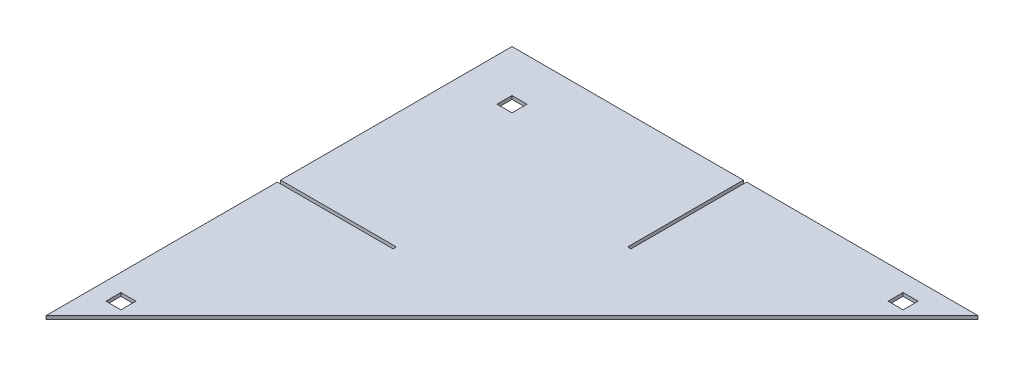
ISO-10303-21;
HEADER;
FILE_DESCRIPTION(('STEP AP214'),'2;1');
FILE_NAME('part.step','',(''),(''),'','','');
FILE_SCHEMA(('AUTOMOTIVE_DESIGN { 1 0 10303 214 1 1 1 1 }'));
ENDSEC;
DATA;
#1=APPLICATION_CONTEXT('core data for automotive mechanical design processes');
#2=APPLICATION_PROTOCOL_DEFINITION('international standard','automotive_design',2000,#1);
#3=PRODUCT_CONTEXT('',#1,'mechanical');
#4=PRODUCT('Part','Part','',(#3));
#5=PRODUCT_RELATED_PRODUCT_CATEGORY('part','',(#4));
#6=PRODUCT_DEFINITION_FORMATION('','',#4);
#7=PRODUCT_DEFINITION_CONTEXT('part definition',#1,'design');
#8=PRODUCT_DEFINITION('design','',#6,#7);
#9=PRODUCT_DEFINITION_SHAPE('','',#8);
#10=(LENGTH_UNIT() NAMED_UNIT(*) SI_UNIT(.MILLI.,.METRE.));
#11=(NAMED_UNIT(*) PLANE_ANGLE_UNIT() SI_UNIT($,.RADIAN.));
#12=(NAMED_UNIT(*) SI_UNIT($,.STERADIAN.) SOLID_ANGLE_UNIT());
#13=UNCERTAINTY_MEASURE_WITH_UNIT(LENGTH_MEASURE(1.E-05),#10,'distance_accuracy_value','');
#14=(GEOMETRIC_REPRESENTATION_CONTEXT(3) GLOBAL_UNCERTAINTY_ASSIGNED_CONTEXT((#13)) GLOBAL_UNIT_ASSIGNED_CONTEXT((#10,
#11,#12)) REPRESENTATION_CONTEXT('',''));
#15=CARTESIAN_POINT('',(0.,0.,0.));
#16=DIRECTION('',(0.,0.,1.));
#17=DIRECTION('',(1.,0.,0.));
#18=AXIS2_PLACEMENT_3D('',#15,#16,#17);
#19=CARTESIAN_POINT('',(0.,1.,1.11022302462516E-13));
#20=DIRECTION('',(0.,-0.999999999999999,0.));
#21=DIRECTION('',(0.,0.,-0.99999999999999));
#22=AXIS2_PLACEMENT_3D('',#19,#20,#21);
#23=PLANE('',#22);
#24=DIRECTION('',(0.,0.,-0.999999999999989));
#25=VECTOR('',#24,1.);
#26=CARTESIAN_POINT('',(-0.711691213118204,1.00000000000004,-13.5510022631347));
#27=LINE('',#26,#25);
#28=CARTESIAN_POINT('',(-0.711691213117802,0.999999999999959,-9.05100226313494));
#29=VERTEX_POINT('',#28);
#30=CARTESIAN_POINT('',(-0.711691213118204,1.00000000000004,-13.5510022631347));
#31=VERTEX_POINT('',#30);
#32=EDGE_CURVE('E220',#29,#31,#27,.T.);
#33=ORIENTED_EDGE('',*,*,#32,.F.);
#34=DIRECTION('',(0.999999999999999,0.,0.));
#35=VECTOR('',#34,1.);
#36=CARTESIAN_POINT('',(-5.21169121311788,1.00000000000001,-9.05100226313516));
#37=LINE('',#36,#35);
#38=CARTESIAN_POINT('',(-5.21169121311788,1.00000000000001,-9.05100226313516));
#39=VERTEX_POINT('',#38);
#40=EDGE_CURVE('E228',#39,#29,#37,.T.);
#41=ORIENTED_EDGE('',*,*,#40,.F.);
#42=DIRECTION('',(0.,0.,0.999999999999989));
#43=VECTOR('',#42,1.);
#44=CARTESIAN_POINT('',(-5.21169121311793,0.999999999999987,-13.551002263135));
#45=LINE('',#44,#43);
#46=CARTESIAN_POINT('',(-5.21169121311793,0.999999999999987,-13.551002263135));
#47=VERTEX_POINT('',#46);
#48=EDGE_CURVE('E225',#47,#39,#45,.T.);
#49=ORIENTED_EDGE('',*,*,#48,.F.);
#50=DIRECTION('',(-0.999999999999999,0.,0.));
#51=VECTOR('',#50,1.);
#52=CARTESIAN_POINT('',(-5.21169121311793,0.999999999999987,-13.551002263135));
#53=LINE('',#52,#51);
#54=EDGE_CURVE('E222',#31,#47,#53,.T.);
#55=ORIENTED_EDGE('',*,*,#54,.F.);
#56=EDGE_LOOP('',(#33,#41,#49,#55));
#57=FACE_BOUND('',#56,.T.);
#58=DIRECTION('',(0.,0.,0.99999999999999));
#59=VECTOR('',#58,1.);
#60=CARTESIAN_POINT('',(-17.9616912131176,0.999999999999654,44.1989977368645));
#61=LINE('',#60,#59);
#62=CARTESIAN_POINT('',(-17.9616912131176,0.999999999999654,44.1989977368645));
#63=VERTEX_POINT('',#62);
#64=CARTESIAN_POINT('',(-17.9616912131181,0.999999999999682,113.698997736864));
#65=VERTEX_POINT('',#64);
#66=EDGE_CURVE('E282',#63,#65,#61,.T.);
#67=ORIENTED_EDGE('',*,*,#66,.T.);
#68=DIRECTION('',(0.707106781186548,0.,-0.707106781186543));
#69=VECTOR('',#68,1.);
#70=CARTESIAN_POINT('',(122.038308786882,0.999999999999515,-26.3010022631347));
#71=LINE('',#70,#69);
#72=CARTESIAN_POINT('',(122.038308786882,0.999999999999515,-26.3010022631347));
#73=VERTEX_POINT('',#72);
#74=EDGE_CURVE('E285',#65,#73,#71,.T.);
#75=ORIENTED_EDGE('',*,*,#74,.T.);
#76=DIRECTION('',(-0.999999999999999,0.,0.));
#77=VECTOR('',#76,1.);
#78=CARTESIAN_POINT('',(122.038308786882,0.999999999999515,-26.3010022631347));
#79=LINE('',#78,#77);
#80=CARTESIAN_POINT('',(52.5383087868823,0.999999999999876,-26.3010022631346));
#81=VERTEX_POINT('',#80);
#82=EDGE_CURVE('E288',#73,#81,#79,.T.);
#83=ORIENTED_EDGE('',*,*,#82,.T.);
#84=DIRECTION('',(0.,0.,0.99999999999999));
#85=VECTOR('',#84,1.);
#86=CARTESIAN_POINT('',(52.5383087868822,0.999999999999626,8.44899773686476));
#87=LINE('',#86,#85);
#88=CARTESIAN_POINT('',(52.5383087868822,0.999999999999626,8.44899773686476));
#89=VERTEX_POINT('',#88);
#90=EDGE_CURVE('E290',#81,#89,#87,.T.);
#91=ORIENTED_EDGE('',*,*,#90,.T.);
#92=DIRECTION('',(-0.999999999999999,0.,0.));
#93=VECTOR('',#92,1.);
#94=CARTESIAN_POINT('',(51.5383087868823,0.999999999999626,8.44899773686477));
#95=LINE('',#94,#93);
#96=CARTESIAN_POINT('',(51.5383087868823,0.999999999999626,8.44899773686477));
#97=VERTEX_POINT('',#96);
#98=EDGE_CURVE('E292',#89,#97,#95,.T.);
#99=ORIENTED_EDGE('',*,*,#98,.T.);
#100=DIRECTION('',(0.,0.,-0.99999999999999));
#101=VECTOR('',#100,1.);
#102=CARTESIAN_POINT('',(51.5383087868823,0.999999999999626,8.44899773686477));
#103=LINE('',#102,#101);
#104=CARTESIAN_POINT('',(51.5383087868823,0.999999999999682,-26.3010022631347));
#105=VERTEX_POINT('',#104);
#106=EDGE_CURVE('E294',#97,#105,#103,.T.);
#107=ORIENTED_EDGE('',*,*,#106,.T.);
#108=DIRECTION('',(-0.999999999999999,0.,0.));
#109=VECTOR('',#108,1.);
#110=CARTESIAN_POINT('',(51.5383087868823,0.999999999999682,-26.3010022631347));
#111=LINE('',#110,#109);
#112=CARTESIAN_POINT('',(-17.961691213118,0.999999999999682,-26.3010022631346));
#113=VERTEX_POINT('',#112);
#114=EDGE_CURVE('E296',#105,#113,#111,.T.);
#115=ORIENTED_EDGE('',*,*,#114,.T.);
#116=DIRECTION('',(0.,0.,0.99999999999999));
#117=VECTOR('',#116,1.);
#118=CARTESIAN_POINT('',(-17.961691213118,0.999999999999682,-26.3010022631346));
#119=LINE('',#118,#117);
#120=CARTESIAN_POINT('',(-17.9616912131176,0.999999999999682,43.1989977368645));
#121=VERTEX_POINT('',#120);
#122=EDGE_CURVE('E298',#113,#121,#119,.T.);
#123=ORIENTED_EDGE('',*,*,#122,.T.);
#124=DIRECTION('',(0.999999999999999,0.,0.));
#125=VECTOR('',#124,1.);
#126=CARTESIAN_POINT('',(16.7883087868818,0.999999999999709,43.1989977368645));
#127=LINE('',#126,#125);
#128=CARTESIAN_POINT('',(16.7883087868818,0.999999999999709,43.1989977368645));
#129=VERTEX_POINT('',#128);
#130=EDGE_CURVE('E300',#121,#129,#127,.T.);
#131=ORIENTED_EDGE('',*,*,#130,.T.);
#132=DIRECTION('',(0.,0.,0.99999999999999));
#133=VECTOR('',#132,1.);
#134=CARTESIAN_POINT('',(16.7883087868818,0.999999999999654,44.1989977368645));
#135=LINE('',#134,#133);
#136=CARTESIAN_POINT('',(16.7883087868818,0.999999999999654,44.1989977368645));
#137=VERTEX_POINT('',#136);
#138=EDGE_CURVE('E302',#129,#137,#135,.T.);
#139=ORIENTED_EDGE('',*,*,#138,.T.);
#140=DIRECTION('',(-0.999999999999999,0.,0.));
#141=VECTOR('',#140,1.);
#142=CARTESIAN_POINT('',(16.7883087868818,0.999999999999654,44.1989977368645));
#143=LINE('',#142,#141);
#144=EDGE_CURVE('E304',#137,#63,#143,.T.);
#145=ORIENTED_EDGE('',*,*,#144,.T.);
#146=EDGE_LOOP('',(#67,#75,#83,#91,#99,#107,#115,#123,#131,#139,#145));
#147=FACE_BOUND('',#146,.T.);
#148=DIRECTION('',(0.,0.,-0.99999999999999));
#149=VECTOR('',#148,1.);
#150=CARTESIAN_POINT('',(109.288308786882,0.999999999999765,-21.0510022631348));
#151=LINE('',#150,#149);
#152=CARTESIAN_POINT('',(109.288308786882,0.999999999999876,-16.5510022631348));
#153=VERTEX_POINT('',#152);
#154=CARTESIAN_POINT('',(109.288308786882,0.999999999999765,-21.0510022631348));
#155=VERTEX_POINT('',#154);
#156=EDGE_CURVE('E251',#153,#155,#151,.T.);
#157=ORIENTED_EDGE('',*,*,#156,.F.);
#158=DIRECTION('',(0.999999999999999,0.,0.));
#159=VECTOR('',#158,1.);
#160=CARTESIAN_POINT('',(104.788308786882,0.999999999999904,-16.5510022631348));
#161=LINE('',#160,#159);
#162=CARTESIAN_POINT('',(104.788308786882,0.999999999999904,-16.5510022631348));
#163=VERTEX_POINT('',#162);
#164=EDGE_CURVE('E259',#163,#153,#161,.T.);
#165=ORIENTED_EDGE('',*,*,#164,.F.);
#166=DIRECTION('',(0.,0.,0.99999999999999));
#167=VECTOR('',#166,1.);
#168=CARTESIAN_POINT('',(104.788308786883,0.999999999999737,-21.0510022631348));
#169=LINE('',#168,#167);
#170=CARTESIAN_POINT('',(104.788308786883,0.999999999999737,-21.0510022631348));
#171=VERTEX_POINT('',#170);
#172=EDGE_CURVE('E256',#171,#163,#169,.T.);
#173=ORIENTED_EDGE('',*,*,#172,.F.);
#174=DIRECTION('',(-0.999999999999999,0.,0.));
#175=VECTOR('',#174,1.);
#176=CARTESIAN_POINT('',(104.788308786883,0.999999999999737,-21.0510022631348));
#177=LINE('',#176,#175);
#178=EDGE_CURVE('E253',#155,#171,#177,.T.);
#179=ORIENTED_EDGE('',*,*,#178,.F.);
#180=EDGE_LOOP('',(#157,#165,#173,#179));
#181=FACE_BOUND('',#180,.T.);
#182=DIRECTION('',(-0.999999999999999,0.,0.));
#183=VECTOR('',#182,1.);
#184=CARTESIAN_POINT('',(-12.7116912131181,0.999999999999709,96.4489977368637));
#185=LINE('',#184,#183);
#186=CARTESIAN_POINT('',(-8.21169121311813,0.999999999999709,96.4489977368638));
#187=VERTEX_POINT('',#186);
#188=CARTESIAN_POINT('',(-12.7116912131181,0.999999999999709,96.4489977368637));
#189=VERTEX_POINT('',#188);
#190=EDGE_CURVE('E184',#187,#189,#185,.T.);
#191=ORIENTED_EDGE('',*,*,#190,.F.);
#192=DIRECTION('',(0.,0.,-0.99999999999999));
#193=VECTOR('',#192,1.);
#194=CARTESIAN_POINT('',(-8.21169121311813,0.999999999999709,96.4489977368638));
#195=LINE('',#194,#193);
#196=CARTESIAN_POINT('',(-8.21169121311818,0.999999999999654,100.948997736864));
#197=VERTEX_POINT('',#196);
#198=EDGE_CURVE('E206',#197,#187,#195,.T.);
#199=ORIENTED_EDGE('',*,*,#198,.F.);
#200=DIRECTION('',(0.999999999999999,0.,0.));
#201=VECTOR('',#200,1.);
#202=CARTESIAN_POINT('',(-12.7116912131182,0.999999999999737,100.948997736864));
#203=LINE('',#202,#201);
#204=CARTESIAN_POINT('',(-12.7116912131182,0.999999999999737,100.948997736864));
#205=VERTEX_POINT('',#204);
#206=EDGE_CURVE('E204',#205,#197,#203,.T.);
#207=ORIENTED_EDGE('',*,*,#206,.F.);
#208=DIRECTION('',(0.,0.,0.99999999999999));
#209=VECTOR('',#208,1.);
#210=CARTESIAN_POINT('',(-12.7116912131181,0.999999999999709,96.4489977368637));
#211=LINE('',#210,#209);
#212=EDGE_CURVE('E192',#189,#205,#211,.T.);
#213=ORIENTED_EDGE('',*,*,#212,.F.);
#214=EDGE_LOOP('',(#191,#199,#207,#213));
#215=FACE_BOUND('',#214,.T.);
#216=ADVANCED_FACE('F29',(#57,#147,#181,#215),#23,.F.);
#217=CARTESIAN_POINT('',(0.,0.,0.));
#218=DIRECTION('',(0.,-0.999999999999999,0.));
#219=DIRECTION('',(0.,0.,-0.99999999999999));
#220=AXIS2_PLACEMENT_3D('',#217,#218,#219);
#221=PLANE('',#220);
#222=DIRECTION('',(0.999999999999999,0.,0.));
#223=VECTOR('',#222,1.);
#224=CARTESIAN_POINT('',(-5.21169121311789,0.,-9.05100226313504));
#225=LINE('',#224,#223);
#226=CARTESIAN_POINT('',(-5.21169121311789,0.,-9.05100226313504));
#227=VERTEX_POINT('',#226);
#228=CARTESIAN_POINT('',(-0.711691213117829,0.,-9.05100226313509));
#229=VERTEX_POINT('',#228);
#230=EDGE_CURVE('E223',#227,#229,#225,.T.);
#231=ORIENTED_EDGE('',*,*,#230,.T.);
#232=DIRECTION('',(0.,0.,-0.999999999999989));
#233=VECTOR('',#232,1.);
#234=CARTESIAN_POINT('',(-0.711691213117968,0.,-13.5510022631348));
#235=LINE('',#234,#233);
#236=CARTESIAN_POINT('',(-0.711691213117968,0.,-13.5510022631348));
#237=VERTEX_POINT('',#236);
#238=EDGE_CURVE('E200',#229,#237,#235,.T.);
#239=ORIENTED_EDGE('',*,*,#238,.T.);
#240=DIRECTION('',(-0.999999999999999,0.,0.));
#241=VECTOR('',#240,1.);
#242=CARTESIAN_POINT('',(-5.21169121311804,0.,-13.5510022631347));
#243=LINE('',#242,#241);
#244=CARTESIAN_POINT('',(-5.21169121311804,0.,-13.5510022631347));
#245=VERTEX_POINT('',#244);
#246=EDGE_CURVE('E233',#237,#245,#243,.T.);
#247=ORIENTED_EDGE('',*,*,#246,.T.);
#248=DIRECTION('',(0.,0.,0.999999999999989));
#249=VECTOR('',#248,1.);
#250=CARTESIAN_POINT('',(-5.21169121311804,0.,-13.5510022631347));
#251=LINE('',#250,#249);
#252=EDGE_CURVE('E236',#245,#227,#251,.T.);
#253=ORIENTED_EDGE('',*,*,#252,.T.);
#254=EDGE_LOOP('',(#231,#239,#247,#253));
#255=FACE_BOUND('',#254,.T.);
#256=DIRECTION('',(0.,0.,0.99999999999999));
#257=VECTOR('',#256,1.);
#258=CARTESIAN_POINT('',(-17.9616912131176,-3.19189119579733E-13,44.1989977368646));
#259=LINE('',#258,#257);
#260=CARTESIAN_POINT('',(-17.9616912131176,-3.19189119579733E-13,44.1989977368646));
#261=VERTEX_POINT('',#260);
#262=CARTESIAN_POINT('',(-17.9616912131177,-3.7470027081099E-13,113.698997736864));
#263=VERTEX_POINT('',#262);
#264=EDGE_CURVE('E281',#261,#263,#259,.T.);
#265=ORIENTED_EDGE('',*,*,#264,.F.);
#266=DIRECTION('',(-0.999999999999999,0.,0.));
#267=VECTOR('',#266,1.);
#268=CARTESIAN_POINT('',(16.7883087868817,-2.91433543964104E-13,44.1989977368644));
#269=LINE('',#268,#267);
#270=CARTESIAN_POINT('',(16.7883087868817,-2.91433543964104E-13,44.1989977368644));
#271=VERTEX_POINT('',#270);
#272=EDGE_CURVE('E286',#271,#261,#269,.T.);
#273=ORIENTED_EDGE('',*,*,#272,.F.);
#274=DIRECTION('',(0.,0.,0.99999999999999));
#275=VECTOR('',#274,1.);
#276=CARTESIAN_POINT('',(16.7883087868817,-2.91433543964104E-13,44.1989977368644));
#277=LINE('',#276,#275);
#278=CARTESIAN_POINT('',(16.788308786882,-3.19189119579733E-13,43.1989977368645));
#279=VERTEX_POINT('',#278);
#280=EDGE_CURVE('E325',#279,#271,#277,.T.);
#281=ORIENTED_EDGE('',*,*,#280,.F.);
#282=DIRECTION('',(0.999999999999999,0.,0.));
#283=VECTOR('',#282,1.);
#284=CARTESIAN_POINT('',(16.788308786882,-3.19189119579733E-13,43.1989977368645));
#285=LINE('',#284,#283);
#286=CARTESIAN_POINT('',(-17.9616912131176,-3.7470027081099E-13,43.1989977368645));
#287=VERTEX_POINT('',#286);
#288=EDGE_CURVE('E323',#287,#279,#285,.T.);
#289=ORIENTED_EDGE('',*,*,#288,.F.);
#290=DIRECTION('',(0.,0.,0.99999999999999));
#291=VECTOR('',#290,1.);
#292=CARTESIAN_POINT('',(-17.961691213118,-3.19189119579733E-13,-26.3010022631346));
#293=LINE('',#292,#291);
#294=CARTESIAN_POINT('',(-17.961691213118,-3.19189119579733E-13,-26.3010022631346));
#295=VERTEX_POINT('',#294);
#296=EDGE_CURVE('E321',#295,#287,#293,.T.);
#297=ORIENTED_EDGE('',*,*,#296,.F.);
#298=DIRECTION('',(-0.999999999999999,0.,0.));
#299=VECTOR('',#298,1.);
#300=CARTESIAN_POINT('',(51.5383087868822,-2.91433543964104E-13,-26.3010022631346));
#301=LINE('',#300,#299);
#302=CARTESIAN_POINT('',(51.5383087868822,-2.91433543964104E-13,-26.3010022631346));
#303=VERTEX_POINT('',#302);
#304=EDGE_CURVE('E319',#303,#295,#301,.T.);
#305=ORIENTED_EDGE('',*,*,#304,.F.);
#306=DIRECTION('',(0.,0.,-0.99999999999999));
#307=VECTOR('',#306,1.);
#308=CARTESIAN_POINT('',(51.5383087868822,-3.7470027081099E-13,8.44899773686476));
#309=LINE('',#308,#307);
#310=CARTESIAN_POINT('',(51.5383087868822,-3.7470027081099E-13,8.44899773686476));
#311=VERTEX_POINT('',#310);
#312=EDGE_CURVE('E317',#311,#303,#309,.T.);
#313=ORIENTED_EDGE('',*,*,#312,.F.);
#314=DIRECTION('',(-0.999999999999999,0.,0.));
#315=VECTOR('',#314,1.);
#316=CARTESIAN_POINT('',(51.5383087868822,-3.7470027081099E-13,8.44899773686476));
#317=LINE('',#316,#315);
#318=CARTESIAN_POINT('',(52.5383087868823,-3.46944695195361E-13,8.44899773686477));
#319=VERTEX_POINT('',#318);
#320=EDGE_CURVE('E315',#319,#311,#317,.T.);
#321=ORIENTED_EDGE('',*,*,#320,.F.);
#322=DIRECTION('',(0.,0.,0.99999999999999));
#323=VECTOR('',#322,1.);
#324=CARTESIAN_POINT('',(52.5383087868823,-3.46944695195361E-13,8.44899773686477));
#325=LINE('',#324,#323);
#326=CARTESIAN_POINT('',(52.5383087868822,0.,-26.3010022631346));
#327=VERTEX_POINT('',#326);
#328=EDGE_CURVE('E313',#327,#319,#325,.T.);
#329=ORIENTED_EDGE('',*,*,#328,.F.);
#330=DIRECTION('',(-0.999999999999999,0.,0.));
#331=VECTOR('',#330,1.);
#332=CARTESIAN_POINT('',(122.038308786882,-4.57966997657877E-13,-26.3010022631346));
#333=LINE('',#332,#331);
#334=CARTESIAN_POINT('',(122.038308786882,-4.57966997657877E-13,-26.3010022631346));
#335=VERTEX_POINT('',#334);
#336=EDGE_CURVE('E311',#335,#327,#333,.T.);
#337=ORIENTED_EDGE('',*,*,#336,.F.);
#338=DIRECTION('',(0.707106781186548,0.,-0.707106781186543));
#339=VECTOR('',#338,1.);
#340=CARTESIAN_POINT('',(122.038308786882,-4.57966997657877E-13,-26.3010022631346));
#341=LINE('',#340,#339);
#342=EDGE_CURVE('E309',#263,#335,#341,.T.);
#343=ORIENTED_EDGE('',*,*,#342,.F.);
#344=EDGE_LOOP('',(#265,#273,#281,#289,#297,#305,#313,#321,#329,#337,#343));
#345=FACE_BOUND('',#344,.T.);
#346=DIRECTION('',(0.999999999999999,0.,0.));
#347=VECTOR('',#346,1.);
#348=CARTESIAN_POINT('',(104.788308786882,-1.2490009027033E-13,-16.5510022631349));
#349=LINE('',#348,#347);
#350=CARTESIAN_POINT('',(104.788308786882,-1.2490009027033E-13,-16.5510022631349));
#351=VERTEX_POINT('',#350);
#352=CARTESIAN_POINT('',(109.288308786882,0.,-16.5510022631348));
#353=VERTEX_POINT('',#352);
#354=EDGE_CURVE('E254',#351,#353,#349,.T.);
#355=ORIENTED_EDGE('',*,*,#354,.T.);
#356=DIRECTION('',(0.,0.,-0.99999999999999));
#357=VECTOR('',#356,1.);
#358=CARTESIAN_POINT('',(109.288308786882,-2.35922392732846E-13,-21.0510022631347));
#359=LINE('',#358,#357);
#360=CARTESIAN_POINT('',(109.288308786882,-2.35922392732846E-13,-21.0510022631347));
#361=VERTEX_POINT('',#360);
#362=EDGE_CURVE('E250',#353,#361,#359,.T.);
#363=ORIENTED_EDGE('',*,*,#362,.T.);
#364=DIRECTION('',(-0.999999999999999,0.,0.));
#365=VECTOR('',#364,1.);
#366=CARTESIAN_POINT('',(104.788308786882,-2.35922392732846E-13,-21.0510022631349));
#367=LINE('',#366,#365);
#368=CARTESIAN_POINT('',(104.788308786882,-2.35922392732846E-13,-21.0510022631349));
#369=VERTEX_POINT('',#368);
#370=EDGE_CURVE('E264',#361,#369,#367,.T.);
#371=ORIENTED_EDGE('',*,*,#370,.T.);
#372=DIRECTION('',(0.,0.,0.99999999999999));
#373=VECTOR('',#372,1.);
#374=CARTESIAN_POINT('',(104.788308786882,-2.35922392732846E-13,-21.0510022631349));
#375=LINE('',#374,#373);
#376=EDGE_CURVE('E267',#369,#351,#375,.T.);
#377=ORIENTED_EDGE('',*,*,#376,.T.);
#378=EDGE_LOOP('',(#355,#363,#371,#377));
#379=FACE_BOUND('',#378,.T.);
#380=DIRECTION('',(0.,0.,-0.99999999999999));
#381=VECTOR('',#380,1.);
#382=CARTESIAN_POINT('',(-8.21169121311803,-3.7470027081099E-13,96.4489977368638));
#383=LINE('',#382,#381);
#384=CARTESIAN_POINT('',(-8.2116912131181,-3.46944695195361E-13,100.948997736864));
#385=VERTEX_POINT('',#384);
#386=CARTESIAN_POINT('',(-8.21169121311803,-3.7470027081099E-13,96.4489977368638));
#387=VERTEX_POINT('',#386);
#388=EDGE_CURVE('E193',#385,#387,#383,.T.);
#389=ORIENTED_EDGE('',*,*,#388,.T.);
#390=DIRECTION('',(-0.999999999999999,0.,0.));
#391=VECTOR('',#390,1.);
#392=CARTESIAN_POINT('',(-12.711691213118,-2.4980018054066E-13,96.4489977368636));
#393=LINE('',#392,#391);
#394=CARTESIAN_POINT('',(-12.711691213118,-2.4980018054066E-13,96.4489977368636));
#395=VERTEX_POINT('',#394);
#396=EDGE_CURVE('E52',#387,#395,#393,.T.);
#397=ORIENTED_EDGE('',*,*,#396,.T.);
#398=DIRECTION('',(0.,0.,0.99999999999999));
#399=VECTOR('',#398,1.);
#400=CARTESIAN_POINT('',(-12.711691213118,-2.4980018054066E-13,96.4489977368636));
#401=LINE('',#400,#399);
#402=CARTESIAN_POINT('',(-12.711691213118,-2.4980018054066E-13,100.948997736864));
#403=VERTEX_POINT('',#402);
#404=EDGE_CURVE('E199',#395,#403,#401,.T.);
#405=ORIENTED_EDGE('',*,*,#404,.T.);
#406=DIRECTION('',(0.999999999999999,0.,0.));
#407=VECTOR('',#406,1.);
#408=CARTESIAN_POINT('',(-12.711691213118,-2.4980018054066E-13,100.948997736864));
#409=LINE('',#408,#407);
#410=EDGE_CURVE('E212',#403,#385,#409,.T.);
#411=ORIENTED_EDGE('',*,*,#410,.T.);
#412=EDGE_LOOP('',(#389,#397,#405,#411));
#413=FACE_BOUND('',#412,.T.);
#414=ADVANCED_FACE('F364',(#255,#345,#379,#413),#221,.T.);
#415=CARTESIAN_POINT('',(-17.9616912131176,0.999999999999654,44.1989977368645));
#416=DIRECTION('',(0.999999999999999,0.,0.));
#417=DIRECTION('',(0.,0.,-0.99999999999999));
#418=AXIS2_PLACEMENT_3D('',#415,#416,#417);
#419=PLANE('',#418);
#420=ORIENTED_EDGE('',*,*,#264,.T.);
#421=DIRECTION('',(0.,-0.999999999999999,0.));
#422=VECTOR('',#421,1.);
#423=CARTESIAN_POINT('',(-17.9616912131181,0.999999999999682,113.698997736864));
#424=LINE('',#423,#422);
#425=EDGE_CURVE('E11',#65,#263,#424,.T.);
#426=ORIENTED_EDGE('',*,*,#425,.F.);
#427=ORIENTED_EDGE('',*,*,#66,.F.);
#428=DIRECTION('',(0.,-0.999999999999999,0.));
#429=VECTOR('',#428,1.);
#430=CARTESIAN_POINT('',(-17.9616912131176,0.999999999999654,44.1989977368645));
#431=LINE('',#430,#429);
#432=EDGE_CURVE('E306',#63,#261,#431,.T.);
#433=ORIENTED_EDGE('',*,*,#432,.T.);
#434=EDGE_LOOP('',(#420,#426,#427,#433));
#435=FACE_BOUND('',#434,.T.);
#436=ADVANCED_FACE('F31',(#435),#419,.F.);
#437=CARTESIAN_POINT('',(122.038308786882,0.999999999999515,-26.3010022631347));
#438=DIRECTION('',(-0.707106781186546,0.,-0.707106781186541));
#439=DIRECTION('',(-0.707106781186548,0.,0.707106781186543));
#440=AXIS2_PLACEMENT_3D('',#437,#438,#439);
#441=PLANE('',#440);
#442=ORIENTED_EDGE('',*,*,#342,.T.);
#443=DIRECTION('',(0.,-0.999999999999999,0.));
#444=VECTOR('',#443,1.);
#445=CARTESIAN_POINT('',(122.038308786882,0.999999999999515,-26.3010022631347));
#446=LINE('',#445,#444);
#447=EDGE_CURVE('E37',#73,#335,#446,.T.);
#448=ORIENTED_EDGE('',*,*,#447,.F.);
#449=ORIENTED_EDGE('',*,*,#74,.F.);
#450=ORIENTED_EDGE('',*,*,#425,.T.);
#451=EDGE_LOOP('',(#442,#448,#449,#450));
#452=FACE_BOUND('',#451,.T.);
#453=ADVANCED_FACE('F382',(#452),#441,.F.);
#454=CARTESIAN_POINT('',(122.038308786882,0.999999999999515,-26.3010022631347));
#455=DIRECTION('',(0.,0.,0.99999999999999));
#456=DIRECTION('',(0.999999999999999,0.,0.));
#457=AXIS2_PLACEMENT_3D('',#454,#455,#456);
#458=PLANE('',#457);
#459=ORIENTED_EDGE('',*,*,#336,.T.);
#460=DIRECTION('',(0.,-0.999999999999999,0.));
#461=VECTOR('',#460,1.);
#462=CARTESIAN_POINT('',(52.5383087868823,0.999999999999876,-26.3010022631346));
#463=LINE('',#462,#461);
#464=EDGE_CURVE('E351',#81,#327,#463,.T.);
#465=ORIENTED_EDGE('',*,*,#464,.F.);
#466=ORIENTED_EDGE('',*,*,#82,.F.);
#467=ORIENTED_EDGE('',*,*,#447,.T.);
#468=EDGE_LOOP('',(#459,#465,#466,#467));
#469=FACE_BOUND('',#468,.T.);
#470=ADVANCED_FACE('F358',(#469),#458,.F.);
#471=CARTESIAN_POINT('',(52.5383087868822,0.999999999999626,8.44899773686476));
#472=DIRECTION('',(0.999999999999999,0.,0.));
#473=DIRECTION('',(0.,0.,-0.99999999999999));
#474=AXIS2_PLACEMENT_3D('',#471,#472,#473);
#475=PLANE('',#474);
#476=ORIENTED_EDGE('',*,*,#328,.T.);
#477=DIRECTION('',(0.,-0.999999999999999,0.));
#478=VECTOR('',#477,1.);
#479=CARTESIAN_POINT('',(52.5383087868822,0.999999999999626,8.44899773686476));
#480=LINE('',#479,#478);
#481=EDGE_CURVE('E348',#89,#319,#480,.T.);
#482=ORIENTED_EDGE('',*,*,#481,.F.);
#483=ORIENTED_EDGE('',*,*,#90,.F.);
#484=ORIENTED_EDGE('',*,*,#464,.T.);
#485=EDGE_LOOP('',(#476,#482,#483,#484));
#486=FACE_BOUND('',#485,.T.);
#487=ADVANCED_FACE('F370',(#486),#475,.F.);
#488=CARTESIAN_POINT('',(51.5383087868823,0.999999999999626,8.44899773686477));
#489=DIRECTION('',(0.,0.,0.99999999999999));
#490=DIRECTION('',(0.999999999999999,0.,0.));
#491=AXIS2_PLACEMENT_3D('',#488,#489,#490);
#492=PLANE('',#491);
#493=ORIENTED_EDGE('',*,*,#320,.T.);
#494=DIRECTION('',(0.,-0.999999999999999,0.));
#495=VECTOR('',#494,1.);
#496=CARTESIAN_POINT('',(51.5383087868823,0.999999999999626,8.44899773686477));
#497=LINE('',#496,#495);
#498=EDGE_CURVE('E345',#97,#311,#497,.T.);
#499=ORIENTED_EDGE('',*,*,#498,.F.);
#500=ORIENTED_EDGE('',*,*,#98,.F.);
#501=ORIENTED_EDGE('',*,*,#481,.T.);
#502=EDGE_LOOP('',(#493,#499,#500,#501));
#503=FACE_BOUND('',#502,.T.);
#504=ADVANCED_FACE('F374',(#503),#492,.F.);
#505=CARTESIAN_POINT('',(51.5383087868823,0.999999999999626,8.44899773686477));
#506=DIRECTION('',(-0.999999999999999,0.,0.));
#507=DIRECTION('',(0.,0.,0.99999999999999));
#508=AXIS2_PLACEMENT_3D('',#505,#506,#507);
#509=PLANE('',#508);
#510=ORIENTED_EDGE('',*,*,#312,.T.);
#511=DIRECTION('',(0.,-0.999999999999999,0.));
#512=VECTOR('',#511,1.);
#513=CARTESIAN_POINT('',(51.5383087868823,0.999999999999682,-26.3010022631347));
#514=LINE('',#513,#512);
#515=EDGE_CURVE('E342',#105,#303,#514,.T.);
#516=ORIENTED_EDGE('',*,*,#515,.F.);
#517=ORIENTED_EDGE('',*,*,#106,.F.);
#518=ORIENTED_EDGE('',*,*,#498,.T.);
#519=EDGE_LOOP('',(#510,#516,#517,#518));
#520=FACE_BOUND('',#519,.T.);
#521=ADVANCED_FACE('F410',(#520),#509,.F.);
#522=CARTESIAN_POINT('',(51.5383087868823,0.999999999999682,-26.3010022631347));
#523=DIRECTION('',(0.,0.,0.99999999999999));
#524=DIRECTION('',(0.999999999999999,0.,0.));
#525=AXIS2_PLACEMENT_3D('',#522,#523,#524);
#526=PLANE('',#525);
#527=ORIENTED_EDGE('',*,*,#304,.T.);
#528=DIRECTION('',(0.,-0.999999999999999,0.));
#529=VECTOR('',#528,1.);
#530=CARTESIAN_POINT('',(-17.961691213118,0.999999999999682,-26.3010022631346));
#531=LINE('',#530,#529);
#532=EDGE_CURVE('E339',#113,#295,#531,.T.);
#533=ORIENTED_EDGE('',*,*,#532,.F.);
#534=ORIENTED_EDGE('',*,*,#114,.F.);
#535=ORIENTED_EDGE('',*,*,#515,.T.);
#536=EDGE_LOOP('',(#527,#533,#534,#535));
#537=FACE_BOUND('',#536,.T.);
#538=ADVANCED_FACE('F408',(#537),#526,.F.);
#539=CARTESIAN_POINT('',(-17.961691213118,0.999999999999682,-26.3010022631346));
#540=DIRECTION('',(0.999999999999999,0.,0.));
#541=DIRECTION('',(0.,0.,-0.99999999999999));
#542=AXIS2_PLACEMENT_3D('',#539,#540,#541);
#543=PLANE('',#542);
#544=ORIENTED_EDGE('',*,*,#296,.T.);
#545=DIRECTION('',(0.,-0.999999999999999,0.));
#546=VECTOR('',#545,1.);
#547=CARTESIAN_POINT('',(-17.9616912131176,0.999999999999682,43.1989977368645));
#548=LINE('',#547,#546);
#549=EDGE_CURVE('E336',#121,#287,#548,.T.);
#550=ORIENTED_EDGE('',*,*,#549,.F.);
#551=ORIENTED_EDGE('',*,*,#122,.F.);
#552=ORIENTED_EDGE('',*,*,#532,.T.);
#553=EDGE_LOOP('',(#544,#550,#551,#552));
#554=FACE_BOUND('',#553,.T.);
#555=ADVANCED_FACE('F403',(#554),#543,.F.);
#556=CARTESIAN_POINT('',(16.7883087868818,0.999999999999709,43.1989977368645));
#557=DIRECTION('',(0.,0.,-0.99999999999999));
#558=DIRECTION('',(-0.999999999999999,0.,0.));
#559=AXIS2_PLACEMENT_3D('',#556,#557,#558);
#560=PLANE('',#559);
#561=ORIENTED_EDGE('',*,*,#288,.T.);
#562=DIRECTION('',(0.,-0.999999999999999,0.));
#563=VECTOR('',#562,1.);
#564=CARTESIAN_POINT('',(16.7883087868818,0.999999999999709,43.1989977368645));
#565=LINE('',#564,#563);
#566=EDGE_CURVE('E333',#129,#279,#565,.T.);
#567=ORIENTED_EDGE('',*,*,#566,.F.);
#568=ORIENTED_EDGE('',*,*,#130,.F.);
#569=ORIENTED_EDGE('',*,*,#549,.T.);
#570=EDGE_LOOP('',(#561,#567,#568,#569));
#571=FACE_BOUND('',#570,.T.);
#572=ADVANCED_FACE('F398',(#571),#560,.F.);
#573=CARTESIAN_POINT('',(16.7883087868818,0.999999999999654,44.1989977368645));
#574=DIRECTION('',(0.999999999999999,0.,0.));
#575=DIRECTION('',(0.,0.,-0.99999999999999));
#576=AXIS2_PLACEMENT_3D('',#573,#574,#575);
#577=PLANE('',#576);
#578=ORIENTED_EDGE('',*,*,#280,.T.);
#579=DIRECTION('',(0.,-0.999999999999999,0.));
#580=VECTOR('',#579,1.);
#581=CARTESIAN_POINT('',(16.7883087868818,0.999999999999654,44.1989977368645));
#582=LINE('',#581,#580);
#583=EDGE_CURVE('E330',#137,#271,#582,.T.);
#584=ORIENTED_EDGE('',*,*,#583,.F.);
#585=ORIENTED_EDGE('',*,*,#138,.F.);
#586=ORIENTED_EDGE('',*,*,#566,.T.);
#587=EDGE_LOOP('',(#578,#584,#585,#586));
#588=FACE_BOUND('',#587,.T.);
#589=ADVANCED_FACE('F394',(#588),#577,.F.);
#590=CARTESIAN_POINT('',(16.7883087868818,0.999999999999654,44.1989977368645));
#591=DIRECTION('',(0.,0.,0.99999999999999));
#592=DIRECTION('',(0.999999999999999,0.,0.));
#593=AXIS2_PLACEMENT_3D('',#590,#591,#592);
#594=PLANE('',#593);
#595=ORIENTED_EDGE('',*,*,#272,.T.);
#596=ORIENTED_EDGE('',*,*,#432,.F.);
#597=ORIENTED_EDGE('',*,*,#144,.F.);
#598=ORIENTED_EDGE('',*,*,#583,.T.);
#599=EDGE_LOOP('',(#595,#596,#597,#598));
#600=FACE_BOUND('',#599,.T.);
#601=ADVANCED_FACE('F389',(#600),#594,.F.);
#602=CARTESIAN_POINT('',(109.288308786882,0.999999999999765,-21.0510022631348));
#603=DIRECTION('',(-0.999999999999999,0.,0.));
#604=DIRECTION('',(0.,0.,0.99999999999999));
#605=AXIS2_PLACEMENT_3D('',#602,#603,#604);
#606=PLANE('',#605);
#607=ORIENTED_EDGE('',*,*,#362,.F.);
#608=DIRECTION('',(0.,-0.999999999999999,0.));
#609=VECTOR('',#608,1.);
#610=CARTESIAN_POINT('',(109.288308786882,0.999999999999876,-16.5510022631348));
#611=LINE('',#610,#609);
#612=EDGE_CURVE('E261',#153,#353,#611,.T.);
#613=ORIENTED_EDGE('',*,*,#612,.F.);
#614=ORIENTED_EDGE('',*,*,#156,.T.);
#615=DIRECTION('',(0.,-0.999999999999999,0.));
#616=VECTOR('',#615,1.);
#617=CARTESIAN_POINT('',(109.288308786882,0.999999999999765,-21.0510022631348));
#618=LINE('',#617,#616);
#619=EDGE_CURVE('E278',#155,#361,#618,.T.);
#620=ORIENTED_EDGE('',*,*,#619,.T.);
#621=EDGE_LOOP('',(#607,#613,#614,#620));
#622=FACE_BOUND('',#621,.T.);
#623=ADVANCED_FACE('F429',(#622),#606,.T.);
#624=CARTESIAN_POINT('',(104.788308786883,0.999999999999737,-21.0510022631348));
#625=DIRECTION('',(0.,0.,0.99999999999999));
#626=DIRECTION('',(0.999999999999999,0.,0.));
#627=AXIS2_PLACEMENT_3D('',#624,#625,#626);
#628=PLANE('',#627);
#629=ORIENTED_EDGE('',*,*,#370,.F.);
#630=ORIENTED_EDGE('',*,*,#619,.F.);
#631=ORIENTED_EDGE('',*,*,#178,.T.);
#632=DIRECTION('',(0.,-0.999999999999999,0.));
#633=VECTOR('',#632,1.);
#634=CARTESIAN_POINT('',(104.788308786883,0.999999999999737,-21.0510022631348));
#635=LINE('',#634,#633);
#636=EDGE_CURVE('E276',#171,#369,#635,.T.);
#637=ORIENTED_EDGE('',*,*,#636,.T.);
#638=EDGE_LOOP('',(#629,#630,#631,#637));
#639=FACE_BOUND('',#638,.T.);
#640=ADVANCED_FACE('F461',(#639),#628,.T.);
#641=CARTESIAN_POINT('',(104.788308786883,0.999999999999737,-21.0510022631348));
#642=DIRECTION('',(0.999999999999999,0.,0.));
#643=DIRECTION('',(0.,0.,-0.99999999999999));
#644=AXIS2_PLACEMENT_3D('',#641,#642,#643);
#645=PLANE('',#644);
#646=ORIENTED_EDGE('',*,*,#376,.F.);
#647=ORIENTED_EDGE('',*,*,#636,.F.);
#648=ORIENTED_EDGE('',*,*,#172,.T.);
#649=DIRECTION('',(0.,-0.999999999999999,0.));
#650=VECTOR('',#649,1.);
#651=CARTESIAN_POINT('',(104.788308786882,0.999999999999904,-16.5510022631348));
#652=LINE('',#651,#650);
#653=EDGE_CURVE('E274',#163,#351,#652,.T.);
#654=ORIENTED_EDGE('',*,*,#653,.T.);
#655=EDGE_LOOP('',(#646,#647,#648,#654));
#656=FACE_BOUND('',#655,.T.);
#657=ADVANCED_FACE('F468',(#656),#645,.T.);
#658=CARTESIAN_POINT('',(104.788308786882,0.999999999999904,-16.5510022631348));
#659=DIRECTION('',(0.,0.,-0.99999999999999));
#660=DIRECTION('',(-0.999999999999999,0.,0.));
#661=AXIS2_PLACEMENT_3D('',#658,#659,#660);
#662=PLANE('',#661);
#663=ORIENTED_EDGE('',*,*,#354,.F.);
#664=ORIENTED_EDGE('',*,*,#653,.F.);
#665=ORIENTED_EDGE('',*,*,#164,.T.);
#666=ORIENTED_EDGE('',*,*,#612,.T.);
#667=EDGE_LOOP('',(#663,#664,#665,#666));
#668=FACE_BOUND('',#667,.T.);
#669=ADVANCED_FACE('F475',(#668),#662,.T.);
#670=CARTESIAN_POINT('',(-0.711691213118204,1.00000000000004,-13.5510022631347));
#671=DIRECTION('',(-0.999999999999999,0.,0.));
#672=DIRECTION('',(0.,0.,0.999999999999989));
#673=AXIS2_PLACEMENT_3D('',#670,#671,#672);
#674=PLANE('',#673);
#675=ORIENTED_EDGE('',*,*,#238,.F.);
#676=DIRECTION('',(0.,-0.999999999999999,0.));
#677=VECTOR('',#676,1.);
#678=CARTESIAN_POINT('',(-0.711691213117802,0.999999999999959,-9.05100226313494));
#679=LINE('',#678,#677);
#680=EDGE_CURVE('E230',#29,#229,#679,.T.);
#681=ORIENTED_EDGE('',*,*,#680,.F.);
#682=ORIENTED_EDGE('',*,*,#32,.T.);
#683=DIRECTION('',(0.,-0.999999999999999,0.));
#684=VECTOR('',#683,1.);
#685=CARTESIAN_POINT('',(-0.711691213118204,1.00000000000004,-13.5510022631347));
#686=LINE('',#685,#684);
#687=EDGE_CURVE('E247',#31,#237,#686,.T.);
#688=ORIENTED_EDGE('',*,*,#687,.T.);
#689=EDGE_LOOP('',(#675,#681,#682,#688));
#690=FACE_BOUND('',#689,.T.);
#691=ADVANCED_FACE('F483',(#690),#674,.T.);
#692=CARTESIAN_POINT('',(-5.21169121311793,0.999999999999987,-13.551002263135));
#693=DIRECTION('',(0.,0.,0.99999999999999));
#694=DIRECTION('',(0.999999999999999,0.,0.));
#695=AXIS2_PLACEMENT_3D('',#692,#693,#694);
#696=PLANE('',#695);
#697=ORIENTED_EDGE('',*,*,#246,.F.);
#698=ORIENTED_EDGE('',*,*,#687,.F.);
#699=ORIENTED_EDGE('',*,*,#54,.T.);
#700=DIRECTION('',(0.,-0.999999999999999,0.));
#701=VECTOR('',#700,1.);
#702=CARTESIAN_POINT('',(-5.21169121311793,0.999999999999987,-13.551002263135));
#703=LINE('',#702,#701);
#704=EDGE_CURVE('E245',#47,#245,#703,.T.);
#705=ORIENTED_EDGE('',*,*,#704,.T.);
#706=EDGE_LOOP('',(#697,#698,#699,#705));
#707=FACE_BOUND('',#706,.T.);
#708=ADVANCED_FACE('F491',(#707),#696,.T.);
#709=CARTESIAN_POINT('',(-5.21169121311793,0.999999999999987,-13.551002263135));
#710=DIRECTION('',(0.999999999999999,0.,0.));
#711=DIRECTION('',(0.,0.,-0.999999999999989));
#712=AXIS2_PLACEMENT_3D('',#709,#710,#711);
#713=PLANE('',#712);
#714=ORIENTED_EDGE('',*,*,#252,.F.);
#715=ORIENTED_EDGE('',*,*,#704,.F.);
#716=ORIENTED_EDGE('',*,*,#48,.T.);
#717=DIRECTION('',(0.,-0.999999999999999,0.));
#718=VECTOR('',#717,1.);
#719=CARTESIAN_POINT('',(-5.21169121311788,1.00000000000001,-9.05100226313516));
#720=LINE('',#719,#718);
#721=EDGE_CURVE('E243',#39,#227,#720,.T.);
#722=ORIENTED_EDGE('',*,*,#721,.T.);
#723=EDGE_LOOP('',(#714,#715,#716,#722));
#724=FACE_BOUND('',#723,.T.);
#725=ADVANCED_FACE('F499',(#724),#713,.T.);
#726=CARTESIAN_POINT('',(-5.21169121311788,1.00000000000001,-9.05100226313516));
#727=DIRECTION('',(0.,0.,-0.99999999999999));
#728=DIRECTION('',(-0.999999999999999,0.,0.));
#729=AXIS2_PLACEMENT_3D('',#726,#727,#728);
#730=PLANE('',#729);
#731=ORIENTED_EDGE('',*,*,#230,.F.);
#732=ORIENTED_EDGE('',*,*,#721,.F.);
#733=ORIENTED_EDGE('',*,*,#40,.T.);
#734=ORIENTED_EDGE('',*,*,#680,.T.);
#735=EDGE_LOOP('',(#731,#732,#733,#734));
#736=FACE_BOUND('',#735,.T.);
#737=ADVANCED_FACE('F507',(#736),#730,.T.);
#738=CARTESIAN_POINT('',(-12.7116912131181,0.999999999999709,96.4489977368637));
#739=DIRECTION('',(0.,0.,0.99999999999999));
#740=DIRECTION('',(0.999999999999999,0.,0.));
#741=AXIS2_PLACEMENT_3D('',#738,#739,#740);
#742=PLANE('',#741);
#743=ORIENTED_EDGE('',*,*,#396,.F.);
#744=DIRECTION('',(0.,-0.999999999999999,0.));
#745=VECTOR('',#744,1.);
#746=CARTESIAN_POINT('',(-8.21169121311813,0.999999999999709,96.4489977368638));
#747=LINE('',#746,#745);
#748=EDGE_CURVE('E188',#187,#387,#747,.T.);
#749=ORIENTED_EDGE('',*,*,#748,.F.);
#750=ORIENTED_EDGE('',*,*,#190,.T.);
#751=DIRECTION('',(0.,-0.999999999999999,0.));
#752=VECTOR('',#751,1.);
#753=CARTESIAN_POINT('',(-12.7116912131181,0.999999999999709,96.4489977368637));
#754=LINE('',#753,#752);
#755=EDGE_CURVE('E187',#189,#395,#754,.T.);
#756=ORIENTED_EDGE('',*,*,#755,.T.);
#757=EDGE_LOOP('',(#743,#749,#750,#756));
#758=FACE_BOUND('',#757,.T.);
#759=ADVANCED_FACE('F186',(#758),#742,.T.);
#760=CARTESIAN_POINT('',(-12.7116912131181,0.999999999999709,96.4489977368637));
#761=DIRECTION('',(0.999999999999999,0.,0.));
#762=DIRECTION('',(0.,0.,-0.99999999999999));
#763=AXIS2_PLACEMENT_3D('',#760,#761,#762);
#764=PLANE('',#763);
#765=ORIENTED_EDGE('',*,*,#404,.F.);
#766=ORIENTED_EDGE('',*,*,#755,.F.);
#767=ORIENTED_EDGE('',*,*,#212,.T.);
#768=DIRECTION('',(0.,-0.999999999999999,0.));
#769=VECTOR('',#768,1.);
#770=CARTESIAN_POINT('',(-12.7116912131182,0.999999999999737,100.948997736864));
#771=LINE('',#770,#769);
#772=EDGE_CURVE('E201',#205,#403,#771,.T.);
#773=ORIENTED_EDGE('',*,*,#772,.T.);
#774=EDGE_LOOP('',(#765,#766,#767,#773));
#775=FACE_BOUND('',#774,.T.);
#776=ADVANCED_FACE('F196',(#775),#764,.T.);
#777=CARTESIAN_POINT('',(-12.7116912131182,0.999999999999737,100.948997736864));
#778=DIRECTION('',(0.,0.,-0.99999999999999));
#779=DIRECTION('',(-0.999999999999999,0.,0.));
#780=AXIS2_PLACEMENT_3D('',#777,#778,#779);
#781=PLANE('',#780);
#782=ORIENTED_EDGE('',*,*,#410,.F.);
#783=ORIENTED_EDGE('',*,*,#772,.F.);
#784=ORIENTED_EDGE('',*,*,#206,.T.);
#785=DIRECTION('',(0.,-0.999999999999999,0.));
#786=VECTOR('',#785,1.);
#787=CARTESIAN_POINT('',(-8.21169121311818,0.999999999999654,100.948997736864));
#788=LINE('',#787,#786);
#789=EDGE_CURVE('E44',#197,#385,#788,.T.);
#790=ORIENTED_EDGE('',*,*,#789,.T.);
#791=EDGE_LOOP('',(#782,#783,#784,#790));
#792=FACE_BOUND('',#791,.T.);
#793=ADVANCED_FACE('F528',(#792),#781,.T.);
#794=CARTESIAN_POINT('',(-8.21169121311813,0.999999999999709,96.4489977368638));
#795=DIRECTION('',(-0.999999999999999,0.,0.));
#796=DIRECTION('',(0.,0.,0.99999999999999));
#797=AXIS2_PLACEMENT_3D('',#794,#795,#796);
#798=PLANE('',#797);
#799=ORIENTED_EDGE('',*,*,#388,.F.);
#800=ORIENTED_EDGE('',*,*,#789,.F.);
#801=ORIENTED_EDGE('',*,*,#198,.T.);
#802=ORIENTED_EDGE('',*,*,#748,.T.);
#803=EDGE_LOOP('',(#799,#800,#801,#802));
#804=FACE_BOUND('',#803,.T.);
#805=ADVANCED_FACE('F535',(#804),#798,.T.);
#806=CLOSED_SHELL('',(#216,#414,#436,#453,#470,#487,#504,#521,#538,#555,#572,#589,#601,#623,
#640,#657,#669,#691,#708,#725,#737,#759,#776,#793,#805));
#807=MANIFOLD_SOLID_BREP('B2',#806);
#808=ADVANCED_BREP_SHAPE_REPRESENTATION('',(#18,#807),#14);
#809=SHAPE_DEFINITION_REPRESENTATION(#9,#808);
ENDSEC;
END-ISO-10303-21;
